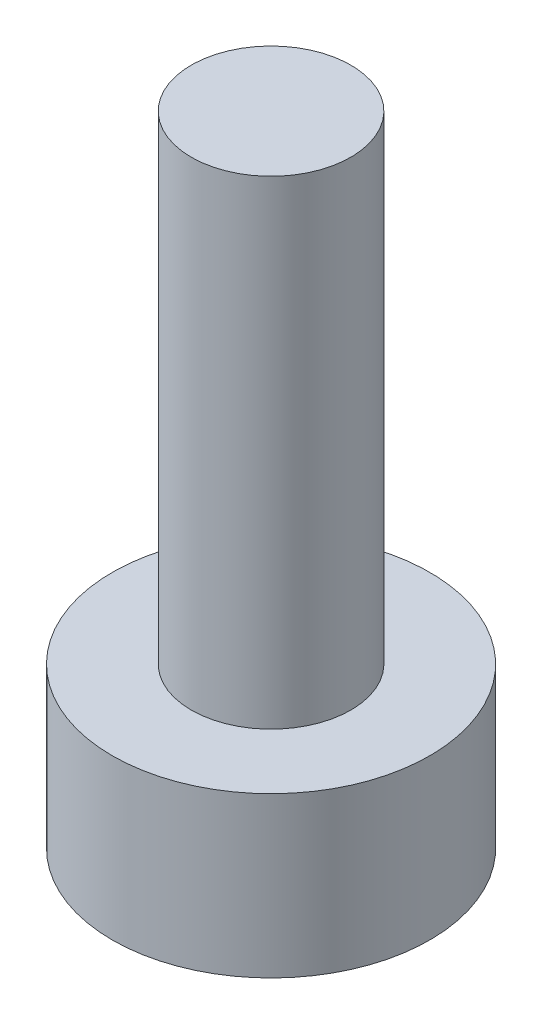
ISO-10303-21;
HEADER;
FILE_DESCRIPTION(('STEP AP214'),'2;1');
FILE_NAME('part.step','',(''),(''),'','','');
FILE_SCHEMA(('AUTOMOTIVE_DESIGN { 1 0 10303 214 1 1 1 1 }'));
ENDSEC;
DATA;
#1=APPLICATION_CONTEXT('core data for automotive mechanical design processes');
#2=APPLICATION_PROTOCOL_DEFINITION('international standard','automotive_design',2000,#1);
#3=PRODUCT_CONTEXT('',#1,'mechanical');
#4=PRODUCT('Part','Part','',(#3));
#5=PRODUCT_RELATED_PRODUCT_CATEGORY('part','',(#4));
#6=PRODUCT_DEFINITION_FORMATION('','',#4);
#7=PRODUCT_DEFINITION_CONTEXT('part definition',#1,'design');
#8=PRODUCT_DEFINITION('design','',#6,#7);
#9=PRODUCT_DEFINITION_SHAPE('','',#8);
#10=(LENGTH_UNIT() NAMED_UNIT(*) SI_UNIT(.MILLI.,.METRE.));
#11=(NAMED_UNIT(*) PLANE_ANGLE_UNIT() SI_UNIT($,.RADIAN.));
#12=(NAMED_UNIT(*) SI_UNIT($,.STERADIAN.) SOLID_ANGLE_UNIT());
#13=UNCERTAINTY_MEASURE_WITH_UNIT(LENGTH_MEASURE(1.E-05),#10,'distance_accuracy_value','');
#14=(GEOMETRIC_REPRESENTATION_CONTEXT(3) GLOBAL_UNCERTAINTY_ASSIGNED_CONTEXT((#13)) GLOBAL_UNIT_ASSIGNED_CONTEXT((#10,
#11,#12)) REPRESENTATION_CONTEXT('',''));
#15=CARTESIAN_POINT('',(0.,0.,0.));
#16=DIRECTION('',(0.,0.,1.));
#17=DIRECTION('',(1.,0.,0.));
#18=AXIS2_PLACEMENT_3D('',#15,#16,#17);
#19=CARTESIAN_POINT('',(-26.2916512459885,-67.,-8.5));
#20=DIRECTION('',(0.,-1.,0.));
#21=DIRECTION('',(0.,0.,-1.));
#22=AXIS2_PLACEMENT_3D('',#19,#20,#21);
#23=CYLINDRICAL_SURFACE('',#22,1.);
#24=CARTESIAN_POINT('',(-26.2916512459885,-67.,-8.5));
#25=DIRECTION('',(0.,1.,0.));
#26=DIRECTION('',(0.,0.,1.));
#27=AXIS2_PLACEMENT_3D('',#24,#25,#26);
#28=CIRCLE('',#27,1.);
#29=CARTESIAN_POINT('',(-26.2916512459885,-67.,-7.5));
#30=VERTEX_POINT('',#29);
#31=EDGE_CURVE('E10',#30,#30,#28,.T.);
#32=ORIENTED_EDGE('',*,*,#31,.F.);
#33=EDGE_LOOP('',(#32));
#34=FACE_BOUND('',#33,.T.);
#35=CARTESIAN_POINT('',(-26.2916512459885,-73.,-8.5));
#36=DIRECTION('',(0.,1.,0.));
#37=DIRECTION('',(0.,0.,1.));
#38=AXIS2_PLACEMENT_3D('',#35,#36,#37);
#39=CIRCLE('',#38,1.);
#40=CARTESIAN_POINT('',(-26.2916512459885,-73.,-7.5));
#41=VERTEX_POINT('',#40);
#42=EDGE_CURVE('E45',#41,#41,#39,.T.);
#43=ORIENTED_EDGE('',*,*,#42,.T.);
#44=EDGE_LOOP('',(#43));
#45=FACE_BOUND('',#44,.T.);
#46=ADVANCED_FACE('F39',(#34,#45),#23,.T.);
#47=CARTESIAN_POINT('',(-26.2916512459885,-67.,-8.5));
#48=DIRECTION('',(0.,1.,0.));
#49=DIRECTION('',(0.,0.,1.));
#50=AXIS2_PLACEMENT_3D('',#47,#48,#49);
#51=PLANE('',#50);
#52=ORIENTED_EDGE('',*,*,#31,.T.);
#53=EDGE_LOOP('',(#52));
#54=FACE_BOUND('',#53,.T.);
#55=ADVANCED_FACE('F65',(#54),#51,.T.);
#56=CARTESIAN_POINT('',(-26.2916512459885,-73.,-8.5));
#57=DIRECTION('',(0.,-1.,0.));
#58=DIRECTION('',(0.,0.,-1.));
#59=AXIS2_PLACEMENT_3D('',#56,#57,#58);
#60=CYLINDRICAL_SURFACE('',#59,1.99);
#61=CARTESIAN_POINT('',(-26.2916512459885,-73.,-8.5));
#62=DIRECTION('',(0.,1.,0.));
#63=DIRECTION('',(0.,0.,1.));
#64=AXIS2_PLACEMENT_3D('',#61,#62,#63);
#65=CIRCLE('',#64,1.99);
#66=CARTESIAN_POINT('',(-26.2916512459885,-73.,-6.51));
#67=VERTEX_POINT('',#66);
#68=EDGE_CURVE('E47',#67,#67,#65,.T.);
#69=ORIENTED_EDGE('',*,*,#68,.F.);
#70=EDGE_LOOP('',(#69));
#71=FACE_BOUND('',#70,.T.);
#72=CARTESIAN_POINT('',(-26.2916512459885,-75.,-8.5));
#73=DIRECTION('',(0.,1.,0.));
#74=DIRECTION('',(0.,0.,1.));
#75=AXIS2_PLACEMENT_3D('',#72,#73,#74);
#76=CIRCLE('',#75,1.99);
#77=CARTESIAN_POINT('',(-26.2916512459885,-75.,-6.51));
#78=VERTEX_POINT('',#77);
#79=EDGE_CURVE('E51',#78,#78,#76,.T.);
#80=ORIENTED_EDGE('',*,*,#79,.T.);
#81=EDGE_LOOP('',(#80));
#82=FACE_BOUND('',#81,.T.);
#83=ADVANCED_FACE('F56',(#71,#82),#60,.T.);
#84=CARTESIAN_POINT('',(-26.2916512459885,-73.,-8.5));
#85=DIRECTION('',(0.,1.,0.));
#86=DIRECTION('',(0.,0.,1.));
#87=AXIS2_PLACEMENT_3D('',#84,#85,#86);
#88=PLANE('',#87);
#89=ORIENTED_EDGE('',*,*,#42,.F.);
#90=EDGE_LOOP('',(#89));
#91=FACE_BOUND('',#90,.T.);
#92=ORIENTED_EDGE('',*,*,#68,.T.);
#93=EDGE_LOOP('',(#92));
#94=FACE_BOUND('',#93,.T.);
#95=ADVANCED_FACE('F60',(#91,#94),#88,.T.);
#96=CARTESIAN_POINT('',(-26.2916512459885,-75.,-8.5));
#97=DIRECTION('',(0.,1.,0.));
#98=DIRECTION('',(0.,0.,1.));
#99=AXIS2_PLACEMENT_3D('',#96,#97,#98);
#100=PLANE('',#99);
#101=ORIENTED_EDGE('',*,*,#79,.F.);
#102=EDGE_LOOP('',(#101));
#103=FACE_BOUND('',#102,.T.);
#104=ADVANCED_FACE('F68',(#103),#100,.F.);
#105=CLOSED_SHELL('',(#46,#55,#83,#95,#104));
#106=MANIFOLD_SOLID_BREP('B2',#105);
#107=ADVANCED_BREP_SHAPE_REPRESENTATION('',(#18,#106),#14);
#108=SHAPE_DEFINITION_REPRESENTATION(#9,#107);
ENDSEC;
END-ISO-10303-21;
